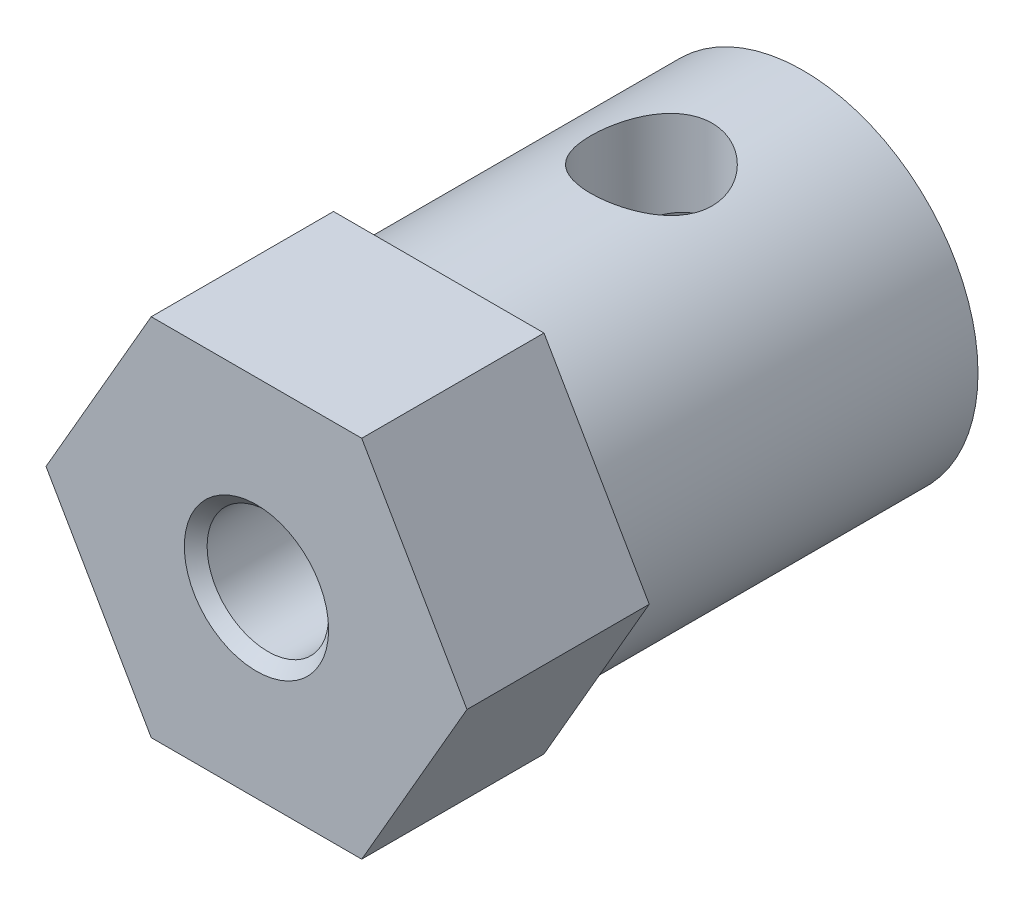
ISO-10303-21;
HEADER;
FILE_DESCRIPTION(('STEP AP214'),'2;1');
FILE_NAME('part.step','',(''),(''),'','','');
FILE_SCHEMA(('AUTOMOTIVE_DESIGN { 1 0 10303 214 1 1 1 1 }'));
ENDSEC;
DATA;
#1=APPLICATION_CONTEXT('core data for automotive mechanical design processes');
#2=APPLICATION_PROTOCOL_DEFINITION('international standard','automotive_design',2000,#1);
#3=PRODUCT_CONTEXT('',#1,'mechanical');
#4=PRODUCT('Part','Part','',(#3));
#5=PRODUCT_RELATED_PRODUCT_CATEGORY('part','',(#4));
#6=PRODUCT_DEFINITION_FORMATION('','',#4);
#7=PRODUCT_DEFINITION_CONTEXT('part definition',#1,'design');
#8=PRODUCT_DEFINITION('design','',#6,#7);
#9=PRODUCT_DEFINITION_SHAPE('','',#8);
#10=(LENGTH_UNIT() NAMED_UNIT(*) SI_UNIT(.MILLI.,.METRE.));
#11=(NAMED_UNIT(*) PLANE_ANGLE_UNIT() SI_UNIT($,.RADIAN.));
#12=(NAMED_UNIT(*) SI_UNIT($,.STERADIAN.) SOLID_ANGLE_UNIT());
#13=UNCERTAINTY_MEASURE_WITH_UNIT(LENGTH_MEASURE(1.E-05),#10,'distance_accuracy_value','');
#14=(GEOMETRIC_REPRESENTATION_CONTEXT(3) GLOBAL_UNCERTAINTY_ASSIGNED_CONTEXT((#13)) GLOBAL_UNIT_ASSIGNED_CONTEXT((#10,
#11,#12)) REPRESENTATION_CONTEXT('',''));
#15=CARTESIAN_POINT('',(0.,0.,0.));
#16=DIRECTION('',(0.,0.,1.));
#17=DIRECTION('',(1.,0.,0.));
#18=AXIS2_PLACEMENT_3D('',#15,#16,#17);
#19=CARTESIAN_POINT('',(-6.92820323027551,0.,0.));
#20=DIRECTION('',(-0.866025403784439,-0.499999999999999,0.));
#21=DIRECTION('',(0.499999999999999,-0.866025403784439,0.));
#22=AXIS2_PLACEMENT_3D('',#19,#20,#21);
#23=PLANE('',#22);
#24=DIRECTION('',(0.499999999999999,-0.866025403784439,0.));
#25=VECTOR('',#24,1.);
#26=CARTESIAN_POINT('',(-6.92820323027551,0.,6.));
#27=LINE('',#26,#25);
#28=CARTESIAN_POINT('',(-6.92820323027551,0.,6.));
#29=VERTEX_POINT('',#28);
#30=CARTESIAN_POINT('',(-3.46410161513776,-6.,6.));
#31=VERTEX_POINT('',#30);
#32=EDGE_CURVE('E125',#29,#31,#27,.T.);
#33=ORIENTED_EDGE('',*,*,#32,.F.);
#34=DIRECTION('',(0.,0.,1.));
#35=VECTOR('',#34,1.);
#36=CARTESIAN_POINT('',(-6.92820323027551,0.,0.));
#37=LINE('',#36,#35);
#38=CARTESIAN_POINT('',(-6.92820323027551,0.,0.));
#39=VERTEX_POINT('',#38);
#40=EDGE_CURVE('E54',#39,#29,#37,.T.);
#41=ORIENTED_EDGE('',*,*,#40,.F.);
#42=DIRECTION('',(0.499999999999999,-0.866025403784439,0.));
#43=VECTOR('',#42,1.);
#44=CARTESIAN_POINT('',(-6.92820323027551,0.,0.));
#45=LINE('',#44,#43);
#46=CARTESIAN_POINT('',(-3.46410161513776,-6.,0.));
#47=VERTEX_POINT('',#46);
#48=EDGE_CURVE('E141',#39,#47,#45,.T.);
#49=ORIENTED_EDGE('',*,*,#48,.T.);
#50=DIRECTION('',(0.,0.,1.));
#51=VECTOR('',#50,1.);
#52=CARTESIAN_POINT('',(-3.46410161513776,-6.,0.));
#53=LINE('',#52,#51);
#54=EDGE_CURVE('E89',#47,#31,#53,.T.);
#55=ORIENTED_EDGE('',*,*,#54,.T.);
#56=EDGE_LOOP('',(#33,#41,#49,#55));
#57=FACE_BOUND('',#56,.T.);
#58=ADVANCED_FACE('F36',(#57),#23,.T.);
#59=CARTESIAN_POINT('',(-3.46410161513775,6.,0.));
#60=DIRECTION('',(-0.866025403784438,0.5,0.));
#61=DIRECTION('',(-0.5,-0.866025403784439,0.));
#62=AXIS2_PLACEMENT_3D('',#59,#60,#61);
#63=PLANE('',#62);
#64=DIRECTION('',(-0.5,-0.866025403784439,0.));
#65=VECTOR('',#64,1.);
#66=CARTESIAN_POINT('',(-3.46410161513775,6.,6.));
#67=LINE('',#66,#65);
#68=CARTESIAN_POINT('',(-3.46410161513775,6.,6.));
#69=VERTEX_POINT('',#68);
#70=EDGE_CURVE('E138',#69,#29,#67,.T.);
#71=ORIENTED_EDGE('',*,*,#70,.F.);
#72=DIRECTION('',(0.,0.,1.));
#73=VECTOR('',#72,1.);
#74=CARTESIAN_POINT('',(-3.46410161513775,6.,0.));
#75=LINE('',#74,#73);
#76=CARTESIAN_POINT('',(-3.46410161513775,6.,0.));
#77=VERTEX_POINT('',#76);
#78=EDGE_CURVE('E77',#77,#69,#75,.T.);
#79=ORIENTED_EDGE('',*,*,#78,.F.);
#80=DIRECTION('',(-0.5,-0.866025403784439,0.));
#81=VECTOR('',#80,1.);
#82=CARTESIAN_POINT('',(-3.46410161513775,6.,0.));
#83=LINE('',#82,#81);
#84=EDGE_CURVE('E115',#77,#39,#83,.T.);
#85=ORIENTED_EDGE('',*,*,#84,.T.);
#86=ORIENTED_EDGE('',*,*,#40,.T.);
#87=EDGE_LOOP('',(#71,#79,#85,#86));
#88=FACE_BOUND('',#87,.T.);
#89=ADVANCED_FACE('F201',(#88),#63,.T.);
#90=CARTESIAN_POINT('',(3.46410161513776,6.,0.));
#91=DIRECTION('',(0.,1.,0.));
#92=DIRECTION('',(0.,0.,1.));
#93=AXIS2_PLACEMENT_3D('',#90,#91,#92);
#94=PLANE('',#93);
#95=DIRECTION('',(-1.,0.,0.));
#96=VECTOR('',#95,1.);
#97=CARTESIAN_POINT('',(3.46410161513776,6.,6.));
#98=LINE('',#97,#96);
#99=CARTESIAN_POINT('',(3.46410161513776,6.,6.));
#100=VERTEX_POINT('',#99);
#101=EDGE_CURVE('E102',#100,#69,#98,.T.);
#102=ORIENTED_EDGE('',*,*,#101,.F.);
#103=DIRECTION('',(0.,0.,1.));
#104=VECTOR('',#103,1.);
#105=CARTESIAN_POINT('',(3.46410161513776,6.,0.));
#106=LINE('',#105,#104);
#107=CARTESIAN_POINT('',(3.46410161513776,6.,0.));
#108=VERTEX_POINT('',#107);
#109=EDGE_CURVE('E97',#108,#100,#106,.T.);
#110=ORIENTED_EDGE('',*,*,#109,.F.);
#111=DIRECTION('',(-1.,0.,0.));
#112=VECTOR('',#111,1.);
#113=CARTESIAN_POINT('',(3.46410161513776,6.,0.));
#114=LINE('',#113,#112);
#115=EDGE_CURVE('E100',#108,#77,#114,.T.);
#116=ORIENTED_EDGE('',*,*,#115,.T.);
#117=ORIENTED_EDGE('',*,*,#78,.T.);
#118=EDGE_LOOP('',(#102,#110,#116,#117));
#119=FACE_BOUND('',#118,.T.);
#120=ADVANCED_FACE('F99',(#119),#94,.T.);
#121=CARTESIAN_POINT('',(6.92820323027551,0.,0.));
#122=DIRECTION('',(0.866025403784439,0.5,0.));
#123=DIRECTION('',(-0.5,0.866025403784439,0.));
#124=AXIS2_PLACEMENT_3D('',#121,#122,#123);
#125=PLANE('',#124);
#126=DIRECTION('',(-0.5,0.866025403784439,0.));
#127=VECTOR('',#126,1.);
#128=CARTESIAN_POINT('',(6.92820323027551,0.,6.));
#129=LINE('',#128,#127);
#130=CARTESIAN_POINT('',(6.92820323027551,0.,6.));
#131=VERTEX_POINT('',#130);
#132=EDGE_CURVE('E135',#131,#100,#129,.T.);
#133=ORIENTED_EDGE('',*,*,#132,.F.);
#134=DIRECTION('',(0.,0.,1.));
#135=VECTOR('',#134,1.);
#136=CARTESIAN_POINT('',(6.92820323027551,0.,0.));
#137=LINE('',#136,#135);
#138=CARTESIAN_POINT('',(6.92820323027551,0.,0.));
#139=VERTEX_POINT('',#138);
#140=EDGE_CURVE('E107',#139,#131,#137,.T.);
#141=ORIENTED_EDGE('',*,*,#140,.F.);
#142=DIRECTION('',(-0.5,0.866025403784439,0.));
#143=VECTOR('',#142,1.);
#144=CARTESIAN_POINT('',(6.92820323027551,0.,0.));
#145=LINE('',#144,#143);
#146=EDGE_CURVE('E113',#139,#108,#145,.T.);
#147=ORIENTED_EDGE('',*,*,#146,.T.);
#148=ORIENTED_EDGE('',*,*,#109,.T.);
#149=EDGE_LOOP('',(#133,#141,#147,#148));
#150=FACE_BOUND('',#149,.T.);
#151=ADVANCED_FACE('F117',(#150),#125,.T.);
#152=CARTESIAN_POINT('',(3.46410161513775,-6.,0.));
#153=DIRECTION('',(0.866025403784439,-0.5,0.));
#154=DIRECTION('',(0.5,0.866025403784439,0.));
#155=AXIS2_PLACEMENT_3D('',#152,#153,#154);
#156=PLANE('',#155);
#157=DIRECTION('',(0.5,0.866025403784439,0.));
#158=VECTOR('',#157,1.);
#159=CARTESIAN_POINT('',(3.46410161513775,-6.,6.));
#160=LINE('',#159,#158);
#161=CARTESIAN_POINT('',(3.46410161513775,-6.,6.));
#162=VERTEX_POINT('',#161);
#163=EDGE_CURVE('E132',#162,#131,#160,.T.);
#164=ORIENTED_EDGE('',*,*,#163,.F.);
#165=DIRECTION('',(0.,0.,1.));
#166=VECTOR('',#165,1.);
#167=CARTESIAN_POINT('',(3.46410161513775,-6.,0.));
#168=LINE('',#167,#166);
#169=CARTESIAN_POINT('',(3.46410161513775,-6.,0.));
#170=VERTEX_POINT('',#169);
#171=EDGE_CURVE('E145',#170,#162,#168,.T.);
#172=ORIENTED_EDGE('',*,*,#171,.F.);
#173=DIRECTION('',(0.5,0.866025403784439,0.));
#174=VECTOR('',#173,1.);
#175=CARTESIAN_POINT('',(3.46410161513775,-6.,0.));
#176=LINE('',#175,#174);
#177=EDGE_CURVE('E118',#170,#139,#176,.T.);
#178=ORIENTED_EDGE('',*,*,#177,.T.);
#179=ORIENTED_EDGE('',*,*,#140,.T.);
#180=EDGE_LOOP('',(#164,#172,#178,#179));
#181=FACE_BOUND('',#180,.T.);
#182=ADVANCED_FACE('F208',(#181),#156,.T.);
#183=CARTESIAN_POINT('',(-3.46410161513776,-6.,0.));
#184=DIRECTION('',(0.,-1.,0.));
#185=DIRECTION('',(0.,0.,-1.));
#186=AXIS2_PLACEMENT_3D('',#183,#184,#185);
#187=PLANE('',#186);
#188=DIRECTION('',(1.,0.,0.));
#189=VECTOR('',#188,1.);
#190=CARTESIAN_POINT('',(-3.46410161513776,-6.,6.));
#191=LINE('',#190,#189);
#192=EDGE_CURVE('E128',#31,#162,#191,.T.);
#193=ORIENTED_EDGE('',*,*,#192,.F.);
#194=ORIENTED_EDGE('',*,*,#54,.F.);
#195=DIRECTION('',(1.,0.,0.));
#196=VECTOR('',#195,1.);
#197=CARTESIAN_POINT('',(-3.46410161513776,-6.,0.));
#198=LINE('',#197,#196);
#199=EDGE_CURVE('E120',#47,#170,#198,.T.);
#200=ORIENTED_EDGE('',*,*,#199,.T.);
#201=ORIENTED_EDGE('',*,*,#171,.T.);
#202=EDGE_LOOP('',(#193,#194,#200,#201));
#203=FACE_BOUND('',#202,.T.);
#204=ADVANCED_FACE('F196',(#203),#187,.T.);
#205=CARTESIAN_POINT('',(0.,0.,0.));
#206=DIRECTION('',(0.,0.,1.));
#207=DIRECTION('',(1.,0.,0.));
#208=AXIS2_PLACEMENT_3D('',#205,#206,#207);
#209=PLANE('',#208);
#210=CARTESIAN_POINT('',(0.,0.,0.));
#211=DIRECTION('',(0.,0.,1.));
#212=DIRECTION('',(1.,0.,0.));
#213=AXIS2_PLACEMENT_3D('',#210,#211,#212);
#214=CIRCLE('',#213,5.75);
#215=CARTESIAN_POINT('',(5.75,0.,0.));
#216=VERTEX_POINT('',#215);
#217=EDGE_CURVE('E222',#216,#216,#214,.T.);
#218=ORIENTED_EDGE('',*,*,#217,.T.);
#219=EDGE_LOOP('',(#218));
#220=FACE_BOUND('',#219,.T.);
#221=ORIENTED_EDGE('',*,*,#48,.F.);
#222=ORIENTED_EDGE('',*,*,#84,.F.);
#223=ORIENTED_EDGE('',*,*,#115,.F.);
#224=ORIENTED_EDGE('',*,*,#146,.F.);
#225=ORIENTED_EDGE('',*,*,#177,.F.);
#226=ORIENTED_EDGE('',*,*,#199,.F.);
#227=EDGE_LOOP('',(#221,#222,#223,#224,#225,#226));
#228=FACE_BOUND('',#227,.T.);
#229=ADVANCED_FACE('F111',(#220,#228),#209,.F.);
#230=CARTESIAN_POINT('',(0.,0.,6.));
#231=DIRECTION('',(0.,0.,1.));
#232=DIRECTION('',(1.,0.,0.));
#233=AXIS2_PLACEMENT_3D('',#230,#231,#232);
#234=PLANE('',#233);
#235=CARTESIAN_POINT('',(0.,0.,6.));
#236=DIRECTION('',(0.,0.,1.));
#237=DIRECTION('',(1.,0.,0.));
#238=AXIS2_PLACEMENT_3D('',#235,#236,#237);
#239=CIRCLE('',#238,2.375);
#240=CARTESIAN_POINT('',(2.375,0.,6.));
#241=VERTEX_POINT('',#240);
#242=EDGE_CURVE('E46',#241,#241,#239,.F.);
#243=ORIENTED_EDGE('',*,*,#242,.T.);
#244=EDGE_LOOP('',(#243));
#245=FACE_BOUND('',#244,.T.);
#246=ORIENTED_EDGE('',*,*,#32,.T.);
#247=ORIENTED_EDGE('',*,*,#192,.T.);
#248=ORIENTED_EDGE('',*,*,#163,.T.);
#249=ORIENTED_EDGE('',*,*,#132,.T.);
#250=ORIENTED_EDGE('',*,*,#101,.T.);
#251=ORIENTED_EDGE('',*,*,#70,.T.);
#252=EDGE_LOOP('',(#246,#247,#248,#249,#250,#251));
#253=FACE_BOUND('',#252,.T.);
#254=ADVANCED_FACE('F190',(#245,#253),#234,.T.);
#255=CARTESIAN_POINT('',(0.,0.,-12.));
#256=DIRECTION('',(0.,0.,1.));
#257=DIRECTION('',(1.,0.,0.));
#258=AXIS2_PLACEMENT_3D('',#255,#256,#257);
#259=CYLINDRICAL_SURFACE('',#258,5.75);
#260=CARTESIAN_POINT('',(0.,-5.75,-5.));
#261=CARTESIAN_POINT('',(-0.108852978365249,-5.75000105977138,-4.99999847605276));
#262=CARTESIAN_POINT('',(-0.217695096262046,-5.7468809830917,-5.00891530264599));
#263=CARTESIAN_POINT('',(-0.432157202530257,-5.73474311765259,-5.04422620104696));
#264=CARTESIAN_POINT('',(-0.537777134658955,-5.72572522600935,-5.07062057774006));
#265=CARTESIAN_POINT('',(-0.742672134315643,-5.70276766059395,-5.13986102453221));
#266=CARTESIAN_POINT('',(-0.84195801047287,-5.6888366512501,-5.18267814420332));
#267=CARTESIAN_POINT('',(-1.03193713439356,-5.6574630536252,-5.28341226596707));
#268=CARTESIAN_POINT('',(-1.12262845549451,-5.64001968069461,-5.3413326429281));
#269=CARTESIAN_POINT('',(-1.29622800224639,-5.60271764264612,-5.47289485603425));
#270=CARTESIAN_POINT('',(-1.37877181526939,-5.58279747059658,-5.54699998115126));
#271=CARTESIAN_POINT('',(-1.53054382641711,-5.54311294173497,-5.7078438303783));
#272=CARTESIAN_POINT('',(-1.59976873225049,-5.52334862460348,-5.79458566886148));
#273=CARTESIAN_POINT('',(-1.72509619684457,-5.48552407526656,-5.98161459511855));
#274=CARTESIAN_POINT('',(-1.78071137601298,-5.46753803395443,-6.08224474438048));
#275=CARTESIAN_POINT('',(-1.87407012610003,-5.43624902273522,-6.29215623393371));
#276=CARTESIAN_POINT('',(-1.91181970820632,-5.42294447804504,-6.40143464990117));
#277=CARTESIAN_POINT('',(-1.96698431950335,-5.40317577936257,-6.62137705882684));
#278=CARTESIAN_POINT('',(-1.98508676076966,-5.3964811809919,-6.73184728421305));
#279=CARTESIAN_POINT('',(-2.00259265649612,-5.39001096702764,-6.95444445734178));
#280=CARTESIAN_POINT('',(-2.00200251085504,-5.39023298334866,-7.06657082491874));
#281=CARTESIAN_POINT('',(-1.98267094037132,-5.39737004860089,-7.28329786208771));
#282=CARTESIAN_POINT('',(-1.96484468215553,-5.40394763135404,-7.38799324741789));
#283=CARTESIAN_POINT('',(-1.91304654963828,-5.42249959851242,-7.5928021417439));
#284=CARTESIAN_POINT('',(-1.87907257989678,-5.43447468332486,-7.69291505423702));
#285=CARTESIAN_POINT('',(-1.79537763727284,-5.46269998592354,-7.88772373137553));
#286=CARTESIAN_POINT('',(-1.74539706558117,-5.47901987559443,-7.98229743150764));
#287=CARTESIAN_POINT('',(-1.63128802471841,-5.51406876213116,-8.16199681263434));
#288=CARTESIAN_POINT('',(-1.56715518557209,-5.53279850237071,-8.24711956310907));
#289=CARTESIAN_POINT('',(-1.42223676822475,-5.57186501514894,-8.41061861686602));
#290=CARTESIAN_POINT('',(-1.34070873037362,-5.59223244327248,-8.48833094809252));
#291=CARTESIAN_POINT('',(-1.16553110913772,-5.63134817365665,-8.62916193353523));
#292=CARTESIAN_POINT('',(-1.07188014909169,-5.65009629162705,-8.69227892805479));
#293=CARTESIAN_POINT('',(-0.873611804787463,-5.68414660658285,-8.80272645587849));
#294=CARTESIAN_POINT('',(-0.76887945860933,-5.699406152222,-8.84986468018437));
#295=CARTESIAN_POINT('',(-0.552311768940697,-5.72444844073633,-8.92564240487892));
#296=CARTESIAN_POINT('',(-0.440479139770791,-5.73423326263741,-8.95428892812568));
#297=CARTESIAN_POINT('',(-0.21849545926509,-5.74687209990773,-8.99106038151012));
#298=CARTESIAN_POINT('',(-0.108509883546711,-5.75002852027091,-9.00008142039351));
#299=CARTESIAN_POINT('',(0.111434426219061,-5.74997110798103,-8.99991751072368));
#300=CARTESIAN_POINT('',(0.221393161453882,-5.74675846011365,-8.99073594825153));
#301=CARTESIAN_POINT('',(0.434480397636876,-5.7345237410022,-8.95512793639705));
#302=CARTESIAN_POINT('',(0.537714854552466,-5.72569124816727,-8.92926387296158));
#303=CARTESIAN_POINT('',(0.738327773381861,-5.70329449927519,-8.8617406394204));
#304=CARTESIAN_POINT('',(0.835705476721866,-5.68972963181587,-8.8200794283316));
#305=CARTESIAN_POINT('',(1.02483137768094,-5.65876849709659,-8.72088246415644));
#306=CARTESIAN_POINT('',(1.11635106072609,-5.64127710756371,-8.66294159169097));
#307=CARTESIAN_POINT('',(1.28865281845096,-5.60443124496091,-8.53329937952551));
#308=CARTESIAN_POINT('',(1.36943134970039,-5.58507616068386,-8.46159351782194));
#309=CARTESIAN_POINT('',(1.52214180412769,-5.5454593147938,-8.30225036027706));
#310=CARTESIAN_POINT('',(1.59343483693754,-5.52520028105738,-8.21399855713608));
#311=CARTESIAN_POINT('',(1.72029440578916,-5.48702921650036,-8.02635822377912));
#312=CARTESIAN_POINT('',(1.77586045138567,-5.46911725888256,-7.92696934638895));
#313=CARTESIAN_POINT('',(1.86951792756813,-5.43781707054005,-7.71960785457887));
#314=CARTESIAN_POINT('',(1.90761420567768,-5.42442758518847,-7.61163763108563));
#315=CARTESIAN_POINT('',(1.96488570955564,-5.40394922705042,-7.39023283004293));
#316=CARTESIAN_POINT('',(1.98407048282081,-5.39685717517642,-7.27680104014157));
#317=CARTESIAN_POINT('',(2.00219056030477,-5.39015926521285,-7.05450432211135));
#318=CARTESIAN_POINT('',(2.00219579967984,-5.39015785230511,-6.94573763682946));
#319=CARTESIAN_POINT('',(1.98462636890616,-5.39665117522238,-6.72984134603797));
#320=CARTESIAN_POINT('',(1.96705293147735,-5.40314545553126,-6.62271162626959));
#321=CARTESIAN_POINT('',(1.91560968443532,-5.42159158710503,-6.41555214132175));
#322=CARTESIAN_POINT('',(1.88211624119565,-5.43341708560692,-6.31541675492714));
#323=CARTESIAN_POINT('',(1.80009668185863,-5.46113696636217,-6.12211468786719));
#324=CARTESIAN_POINT('',(1.75156705321561,-5.47703229920316,-6.0289496418363));
#325=CARTESIAN_POINT('',(1.63820986264075,-5.51202675271731,-5.84750701006089));
#326=CARTESIAN_POINT('',(1.57272640439311,-5.53124091497049,-5.75966156866263));
#327=CARTESIAN_POINT('',(1.42839709339464,-5.57025708065954,-5.59586159187356));
#328=CARTESIAN_POINT('',(1.34954730547059,-5.59005925579168,-5.51991057101754));
#329=CARTESIAN_POINT('',(1.17657783293987,-5.62906303688251,-5.37868422926783));
#330=CARTESIAN_POINT('',(1.08194016541955,-5.6482002284327,-5.31402310323816));
#331=CARTESIAN_POINT('',(0.882491703832236,-5.68277534462883,-5.2015820521677));
#332=CARTESIAN_POINT('',(0.777682430932428,-5.69821382122474,-5.15379960785804));
#333=CARTESIAN_POINT('',(0.562471003980704,-5.72343194027046,-5.07738200592012));
#334=CARTESIAN_POINT('',(0.452179507396609,-5.7332948736695,-5.04846397271358));
#335=CARTESIAN_POINT('',(0.227920527633803,-5.74657724914793,-5.00977703551417));
#336=CARTESIAN_POINT('',(0.113954312686564,-5.74999889056302,-5.00000159536618));
#337=CARTESIAN_POINT('',(0.,-5.75,-5.));
#338=B_SPLINE_CURVE_WITH_KNOTS('',3,(#260,#261,#262,#263,#264,#265,#266,#267,#268,#269,#270,
#271,#272,#273,#274,#275,#276,#277,#278,#279,#280,#281,#282,#283,#284,#285,#286,#287,#288,#289,
#290,#291,#292,#293,#294,#295,#296,#297,#298,#299,#300,#301,#302,#303,#304,#305,#306,#307,#308,
#309,#310,#311,#312,#313,#314,#315,#316,#317,#318,#319,#320,#321,#322,#323,#324,#325,#326,#327,
#328,#329,#330,#331,#332,#333,#334,#335,#336,#337),.UNSPECIFIED.,.T.,.F.,(4,2,2,2,2,2,2,2,2,2,2,
2,2,2,2,2,2,2,2,2,2,2,2,2,2,2,2,2,2,2,2,2,2,2,2,2,2,2,4),(0.,0.32613924766348,0.652284184780103,
0.977856808289853,1.30350224441925,1.64010141968048,1.97678369205918,2.32417411211769,
2.67144756344385,3.00613452597769,3.34070690086606,3.65843808310683,3.97621050763108,
4.29942249217286,4.62273441898187,4.96453129941075,5.3063670278975,5.65218178158108,
5.99786512285308,6.32740068856532,6.65687495922301,6.9757848499627,7.29473595773798,
7.62246000007288,7.95029188944544,8.29441087883626,8.63854059837753,8.9825747706908,
9.32643516783486,9.65111291601981,9.97576789749261,10.2931029151941,10.6105121202775,
10.9427610820904,11.2751080315514,11.6220288757028,11.9688979174354,12.3104381374149,
12.6518617196241),.UNSPECIFIED.);
#339=CARTESIAN_POINT('',(0.,-5.75,-5.));
#340=VERTEX_POINT('',#339);
#341=EDGE_CURVE('E173',#340,#340,#338,.T.);
#342=ORIENTED_EDGE('',*,*,#341,.F.);
#343=EDGE_LOOP('',(#342));
#344=FACE_BOUND('',#343,.T.);
#345=CARTESIAN_POINT('',(0.,5.75,-5.));
#346=CARTESIAN_POINT('',(0.108852978365252,5.75000105977138,-4.99999847605276));
#347=CARTESIAN_POINT('',(0.217695096262048,5.7468809830917,-5.00891530264599));
#348=CARTESIAN_POINT('',(0.43215720253026,5.73474311765259,-5.04422620104696));
#349=CARTESIAN_POINT('',(0.537777134658958,5.72572522600935,-5.07062057774006));
#350=CARTESIAN_POINT('',(0.742672134315646,5.70276766059395,-5.13986102453221));
#351=CARTESIAN_POINT('',(0.841958010472873,5.6888366512501,-5.18267814420332));
#352=CARTESIAN_POINT('',(1.03193713439357,5.6574630536252,-5.28341226596707));
#353=CARTESIAN_POINT('',(1.12262845549452,5.64001968069461,-5.3413326429281));
#354=CARTESIAN_POINT('',(1.29622800224639,5.60271764264612,-5.47289485603425));
#355=CARTESIAN_POINT('',(1.37877181526939,5.58279747059658,-5.54699998115126));
#356=CARTESIAN_POINT('',(1.53054382641712,5.54311294173497,-5.7078438303783));
#357=CARTESIAN_POINT('',(1.59976873225049,5.52334862460348,-5.79458566886148));
#358=CARTESIAN_POINT('',(1.72509619684457,5.48552407526656,-5.98161459511855));
#359=CARTESIAN_POINT('',(1.78071137601298,5.46753803395443,-6.08224474438048));
#360=CARTESIAN_POINT('',(1.87407012610003,5.43624902273521,-6.2921562339337));
#361=CARTESIAN_POINT('',(1.91181970820632,5.42294447804504,-6.40143464990117));
#362=CARTESIAN_POINT('',(1.96698431950335,5.40317577936257,-6.62137705882684));
#363=CARTESIAN_POINT('',(1.98508676076967,5.3964811809919,-6.73184728421305));
#364=CARTESIAN_POINT('',(2.00259265649612,5.39001096702764,-6.95444445734177));
#365=CARTESIAN_POINT('',(2.00200251085504,5.39023298334866,-7.06657082491874));
#366=CARTESIAN_POINT('',(1.98267094037133,5.39737004860089,-7.28329786208771));
#367=CARTESIAN_POINT('',(1.96484468215553,5.40394763135404,-7.38799324741788));
#368=CARTESIAN_POINT('',(1.91304654963829,5.42249959851242,-7.5928021417439));
#369=CARTESIAN_POINT('',(1.87907257989678,5.43447468332486,-7.69291505423702));
#370=CARTESIAN_POINT('',(1.79537763727285,5.46269998592354,-7.88772373137553));
#371=CARTESIAN_POINT('',(1.74539706558118,5.47901987559443,-7.98229743150764));
#372=CARTESIAN_POINT('',(1.63128802471842,5.51406876213116,-8.16199681263434));
#373=CARTESIAN_POINT('',(1.5671551855721,5.53279850237071,-8.24711956310906));
#374=CARTESIAN_POINT('',(1.42223676822475,5.57186501514894,-8.41061861686602));
#375=CARTESIAN_POINT('',(1.34070873037362,5.59223244327248,-8.48833094809252));
#376=CARTESIAN_POINT('',(1.16553110913772,5.63134817365665,-8.62916193353523));
#377=CARTESIAN_POINT('',(1.07188014909169,5.65009629162705,-8.69227892805479));
#378=CARTESIAN_POINT('',(0.873611804787469,5.68414660658285,-8.80272645587849));
#379=CARTESIAN_POINT('',(0.768879458609336,5.69940615222199,-8.84986468018437));
#380=CARTESIAN_POINT('',(0.552311768940703,5.72444844073632,-8.92564240487892));
#381=CARTESIAN_POINT('',(0.440479139770796,5.73423326263741,-8.95428892812568));
#382=CARTESIAN_POINT('',(0.218495459265095,5.74687209990773,-8.99106038151012));
#383=CARTESIAN_POINT('',(0.108509883546716,5.75002852027091,-9.00008142039351));
#384=CARTESIAN_POINT('',(-0.111434426219056,5.74997110798103,-8.99991751072368));
#385=CARTESIAN_POINT('',(-0.221393161453876,5.74675846011365,-8.99073594825153));
#386=CARTESIAN_POINT('',(-0.43448039763687,5.7345237410022,-8.95512793639705));
#387=CARTESIAN_POINT('',(-0.53771485455246,5.72569124816727,-8.92926387296158));
#388=CARTESIAN_POINT('',(-0.738327773381856,5.70329449927519,-8.8617406394204));
#389=CARTESIAN_POINT('',(-0.835705476721861,5.68972963181587,-8.8200794283316));
#390=CARTESIAN_POINT('',(-1.02483137768094,5.65876849709659,-8.72088246415644));
#391=CARTESIAN_POINT('',(-1.11635106072608,5.64127710756372,-8.66294159169097));
#392=CARTESIAN_POINT('',(-1.28865281845096,5.60443124496091,-8.53329937952552));
#393=CARTESIAN_POINT('',(-1.36943134970039,5.58507616068386,-8.46159351782194));
#394=CARTESIAN_POINT('',(-1.52214180412769,5.5454593147938,-8.30225036027707));
#395=CARTESIAN_POINT('',(-1.59343483693754,5.52520028105738,-8.21399855713608));
#396=CARTESIAN_POINT('',(-1.72029440578916,5.48702921650036,-8.02635822377912));
#397=CARTESIAN_POINT('',(-1.77586045138566,5.46911725888256,-7.92696934638895));
#398=CARTESIAN_POINT('',(-1.86951792756812,5.43781707054005,-7.71960785457887));
#399=CARTESIAN_POINT('',(-1.90761420567768,5.42442758518847,-7.61163763108562));
#400=CARTESIAN_POINT('',(-1.96488570955564,5.40394922705042,-7.39023283004293));
#401=CARTESIAN_POINT('',(-1.98407048282081,5.39685717517642,-7.27680104014157));
#402=CARTESIAN_POINT('',(-2.00219056030476,5.39015926521285,-7.05450432211135));
#403=CARTESIAN_POINT('',(-2.00219579967983,5.39015785230511,-6.94573763682946));
#404=CARTESIAN_POINT('',(-1.98462636890616,5.39665117522238,-6.72984134603797));
#405=CARTESIAN_POINT('',(-1.96705293147734,5.40314545553127,-6.62271162626959));
#406=CARTESIAN_POINT('',(-1.91560968443531,5.42159158710504,-6.41555214132175));
#407=CARTESIAN_POINT('',(-1.88211624119565,5.43341708560692,-6.31541675492714));
#408=CARTESIAN_POINT('',(-1.80009668185863,5.46113696636217,-6.12211468786719));
#409=CARTESIAN_POINT('',(-1.7515670532156,5.47703229920316,-6.0289496418363));
#410=CARTESIAN_POINT('',(-1.63820986264075,5.51202675271731,-5.8475070100609));
#411=CARTESIAN_POINT('',(-1.5727264043931,5.5312409149705,-5.75966156866264));
#412=CARTESIAN_POINT('',(-1.42839709339464,5.57025708065954,-5.59586159187356));
#413=CARTESIAN_POINT('',(-1.34954730547059,5.59005925579168,-5.51991057101754));
#414=CARTESIAN_POINT('',(-1.17657783293987,5.62906303688251,-5.37868422926783));
#415=CARTESIAN_POINT('',(-1.08194016541954,5.6482002284327,-5.31402310323816));
#416=CARTESIAN_POINT('',(-0.882491703832234,5.68277534462883,-5.2015820521677));
#417=CARTESIAN_POINT('',(-0.777682430932426,5.69821382122474,-5.15379960785804));
#418=CARTESIAN_POINT('',(-0.562471003980701,5.72343194027046,-5.07738200592012));
#419=CARTESIAN_POINT('',(-0.452179507396606,5.7332948736695,-5.04846397271358));
#420=CARTESIAN_POINT('',(-0.2279205276338,5.74657724914793,-5.00977703551417));
#421=CARTESIAN_POINT('',(-0.113954312686561,5.74999889056302,-5.00000159536618));
#422=CARTESIAN_POINT('',(0.,5.75,-5.));
#423=B_SPLINE_CURVE_WITH_KNOTS('',3,(#345,#346,#347,#348,#349,#350,#351,#352,#353,#354,#355,
#356,#357,#358,#359,#360,#361,#362,#363,#364,#365,#366,#367,#368,#369,#370,#371,#372,#373,#374,
#375,#376,#377,#378,#379,#380,#381,#382,#383,#384,#385,#386,#387,#388,#389,#390,#391,#392,#393,
#394,#395,#396,#397,#398,#399,#400,#401,#402,#403,#404,#405,#406,#407,#408,#409,#410,#411,#412,
#413,#414,#415,#416,#417,#418,#419,#420,#421,#422),.UNSPECIFIED.,.T.,.F.,(4,2,2,2,2,2,2,2,2,2,2,
2,2,2,2,2,2,2,2,2,2,2,2,2,2,2,2,2,2,2,2,2,2,2,2,2,2,2,4),(0.,0.326139247663481,
0.652284184780103,0.977856808289853,1.30350224441925,1.64010141968048,1.97678369205918,
2.32417411211769,2.67144756344385,3.00613452597769,3.34070690086606,3.65843808310683,
3.97621050763108,4.29942249217286,4.62273441898187,4.96453129941074,5.3063670278975,
5.65218178158108,5.99786512285308,6.32740068856532,6.65687495922301,6.9757848499627,
7.29473595773798,7.62246000007288,7.95029188944544,8.29441087883626,8.63854059837753,
8.9825747706908,9.32643516783486,9.65111291601981,9.97576789749261,10.2931029151941,
10.6105121202775,10.9427610820904,11.2751080315514,11.6220288757028,11.9688979174354,
12.3104381374149,12.6518617196241),.UNSPECIFIED.);
#424=CARTESIAN_POINT('',(0.,5.75,-5.));
#425=VERTEX_POINT('',#424);
#426=EDGE_CURVE('E179',#425,#425,#423,.T.);
#427=ORIENTED_EDGE('',*,*,#426,.F.);
#428=EDGE_LOOP('',(#427));
#429=FACE_BOUND('',#428,.T.);
#430=CARTESIAN_POINT('',(0.,0.,-12.));
#431=DIRECTION('',(0.,0.,1.));
#432=DIRECTION('',(1.,0.,0.));
#433=AXIS2_PLACEMENT_3D('',#430,#431,#432);
#434=CIRCLE('',#433,5.75);
#435=CARTESIAN_POINT('',(5.75,0.,-12.));
#436=VERTEX_POINT('',#435);
#437=EDGE_CURVE('E129',#436,#436,#434,.T.);
#438=ORIENTED_EDGE('',*,*,#437,.T.);
#439=EDGE_LOOP('',(#438));
#440=FACE_BOUND('',#439,.T.);
#441=ORIENTED_EDGE('',*,*,#217,.F.);
#442=EDGE_LOOP('',(#441));
#443=FACE_BOUND('',#442,.T.);
#444=ADVANCED_FACE('F184',(#344,#429,#440,#443),#259,.T.);
#445=CARTESIAN_POINT('',(5.75,0.,-12.));
#446=DIRECTION('',(0.,0.,-1.));
#447=DIRECTION('',(-1.,0.,0.));
#448=AXIS2_PLACEMENT_3D('',#445,#446,#447);
#449=PLANE('',#448);
#450=CARTESIAN_POINT('',(0.,0.,-12.));
#451=DIRECTION('',(0.,0.,-1.));
#452=DIRECTION('',(-1.,0.,0.));
#453=AXIS2_PLACEMENT_3D('',#450,#451,#452);
#454=CIRCLE('',#453,3.);
#455=CARTESIAN_POINT('',(-3.,0.,-12.));
#456=VERTEX_POINT('',#455);
#457=EDGE_CURVE('E230',#456,#456,#454,.T.);
#458=ORIENTED_EDGE('',*,*,#457,.F.);
#459=EDGE_LOOP('',(#458));
#460=FACE_BOUND('',#459,.T.);
#461=ORIENTED_EDGE('',*,*,#437,.F.);
#462=EDGE_LOOP('',(#461));
#463=FACE_BOUND('',#462,.T.);
#464=ADVANCED_FACE('F189',(#460,#463),#449,.T.);
#465=CARTESIAN_POINT('',(0.,0.,-12.));
#466=DIRECTION('',(0.,0.,-1.));
#467=DIRECTION('',(-1.,0.,0.));
#468=AXIS2_PLACEMENT_3D('',#465,#466,#467);
#469=CYLINDRICAL_SURFACE('',#468,2.);
#470=CARTESIAN_POINT('',(0.,0.,5.625));
#471=DIRECTION('',(0.,0.,1.));
#472=DIRECTION('',(1.,0.,0.));
#473=AXIS2_PLACEMENT_3D('',#470,#471,#472);
#474=CIRCLE('',#473,2.);
#475=CARTESIAN_POINT('',(2.,0.,5.625));
#476=VERTEX_POINT('',#475);
#477=EDGE_CURVE('E11',#476,#476,#474,.T.);
#478=ORIENTED_EDGE('',*,*,#477,.T.);
#479=EDGE_LOOP('',(#478));
#480=FACE_BOUND('',#479,.T.);
#481=CARTESIAN_POINT('',(0.,0.,0.));
#482=DIRECTION('',(0.,0.,-1.));
#483=DIRECTION('',(-1.,0.,0.));
#484=AXIS2_PLACEMENT_3D('',#481,#482,#483);
#485=CIRCLE('',#484,2.);
#486=CARTESIAN_POINT('',(-2.,0.,0.));
#487=VERTEX_POINT('',#486);
#488=EDGE_CURVE('E225',#487,#487,#485,.T.);
#489=ORIENTED_EDGE('',*,*,#488,.T.);
#490=EDGE_LOOP('',(#489));
#491=FACE_BOUND('',#490,.T.);
#492=ADVANCED_FACE('F245',(#480,#491),#469,.F.);
#493=CARTESIAN_POINT('',(2.,0.,0.));
#494=DIRECTION('',(0.,0.,1.));
#495=DIRECTION('',(1.,0.,0.));
#496=AXIS2_PLACEMENT_3D('',#493,#494,#495);
#497=PLANE('',#496);
#498=ORIENTED_EDGE('',*,*,#488,.F.);
#499=EDGE_LOOP('',(#498));
#500=FACE_BOUND('',#499,.T.);
#501=CARTESIAN_POINT('',(0.,0.,0.));
#502=DIRECTION('',(0.,0.,-1.));
#503=DIRECTION('',(-1.,0.,0.));
#504=AXIS2_PLACEMENT_3D('',#501,#502,#503);
#505=CIRCLE('',#504,3.);
#506=CARTESIAN_POINT('',(-3.,0.,0.));
#507=VERTEX_POINT('',#506);
#508=EDGE_CURVE('E228',#507,#507,#505,.T.);
#509=ORIENTED_EDGE('',*,*,#508,.T.);
#510=EDGE_LOOP('',(#509));
#511=FACE_BOUND('',#510,.T.);
#512=ADVANCED_FACE('F250',(#500,#511),#497,.F.);
#513=CARTESIAN_POINT('',(0.,0.,-12.));
#514=DIRECTION('',(0.,0.,-1.));
#515=DIRECTION('',(-1.,0.,0.));
#516=AXIS2_PLACEMENT_3D('',#513,#514,#515);
#517=CYLINDRICAL_SURFACE('',#516,3.);
#518=CARTESIAN_POINT('',(0.,-3.,-5.));
#519=CARTESIAN_POINT('',(-0.100484716668076,-3.00000041644839,-4.99999945036753));
#520=CARTESIAN_POINT('',(-0.200969087132899,-2.99490802753388,-5.0076139699555));
#521=CARTESIAN_POINT('',(-0.398733058031679,-2.97504652423808,-5.03759686410566));
#522=CARTESIAN_POINT('',(-0.496011113955004,-2.96027281581234,-5.05997224312329));
#523=CARTESIAN_POINT('',(-0.684212307854247,-2.92250482404708,-5.11810771732484));
#524=CARTESIAN_POINT('',(-0.775162872657552,-2.89954905493315,-5.15380514000794));
#525=CARTESIAN_POINT('',(-0.949415290997258,-2.8472613787744,-5.2370633632715));
#526=CARTESIAN_POINT('',(-1.03271603160967,-2.81792854605509,-5.28462588630056));
#527=CARTESIAN_POINT('',(-1.19728470077011,-2.75227329369838,-5.39465693736743));
#528=CARTESIAN_POINT('',(-1.27778030546067,-2.71556897579319,-5.45804786074289));
#529=CARTESIAN_POINT('',(-1.42772804469274,-2.63982313083466,-5.59573004865845));
#530=CARTESIAN_POINT('',(-1.49716405543888,-2.60077830356832,-5.67003692983773));
#531=CARTESIAN_POINT('',(-1.63422297745496,-2.51728264678793,-5.84105236761267));
#532=CARTESIAN_POINT('',(-1.6998318636275,-2.47295067937795,-5.93944565320345));
#533=CARTESIAN_POINT('',(-1.81350357014174,-2.3908414735282,-6.14836337764653));
#534=CARTESIAN_POINT('',(-1.86159673426502,-2.35305295954667,-6.25886640156274));
#535=CARTESIAN_POINT('',(-1.92674035011438,-2.2997626664146,-6.45671129342162));
#536=CARTESIAN_POINT('',(-1.94874447236008,-2.28097627892403,-6.54152845287391));
#537=CARTESIAN_POINT('',(-1.98150617785228,-2.25257969659604,-6.71474450474165));
#538=CARTESIAN_POINT('',(-1.99228314651963,-2.24295368744147,-6.80313694872606));
#539=CARTESIAN_POINT('',(-2.00191364141227,-2.23436605608045,-6.98147477885647));
#540=CARTESIAN_POINT('',(-2.00071842917524,-2.23544802558502,-7.0714250234524));
#541=CARTESIAN_POINT('',(-1.98637581333356,-2.24819775483425,-7.24963497349975));
#542=CARTESIAN_POINT('',(-1.97321828380393,-2.25987448286881,-7.33789318202813));
#543=CARTESIAN_POINT('',(-1.93664994217326,-2.29127185989959,-7.50646705124188));
#544=CARTESIAN_POINT('',(-1.91371711479477,-2.31061488324374,-7.58696133593877));
#545=CARTESIAN_POINT('',(-1.85870118583424,-2.35509622933623,-7.74302369097578));
#546=CARTESIAN_POINT('',(-1.8266150732855,-2.38023645854889,-7.81859013023865));
#547=CARTESIAN_POINT('',(-1.74673818732648,-2.43964196377947,-7.97902539535644));
#548=CARTESIAN_POINT('',(-1.69708052300445,-2.47472317740626,-8.06265990048309));
#549=CARTESIAN_POINT('',(-1.58668960438221,-2.54691537733438,-8.22138339528575));
#550=CARTESIAN_POINT('',(-1.52594268999614,-2.58402882709328,-8.29646165776207));
#551=CARTESIAN_POINT('',(-1.37981165322309,-2.66543343763724,-8.45254254560342));
#552=CARTESIAN_POINT('',(-1.29193938283656,-2.7095474472056,-8.53133404868276));
#553=CARTESIAN_POINT('',(-1.10200799908008,-2.79218100665211,-8.67319649453848));
#554=CARTESIAN_POINT('',(-0.999962299343698,-2.83070577648042,-8.73628214540898));
#555=CARTESIAN_POINT('',(-0.804857827096532,-2.89145404090364,-8.83347771862287));
#556=CARTESIAN_POINT('',(-0.713957643371912,-2.91539261165539,-8.87084336333893));
#557=CARTESIAN_POINT('',(-0.526036043935483,-2.95507719030498,-8.93210492562537));
#558=CARTESIAN_POINT('',(-0.429019879001653,-2.97083012127543,-8.95601222713221));
#559=CARTESIAN_POINT('',(-0.230985453172284,-2.99275882156808,-8.989161165238));
#560=CARTESIAN_POINT('',(-0.129951811934161,-2.99889322461186,-8.99833946093826));
#561=CARTESIAN_POINT('',(0.0724415193893439,-3.00083114965146,-9.0012470885622));
#562=CARTESIAN_POINT('',(0.173801186186622,-2.99663539385634,-8.99497750048877));
#563=CARTESIAN_POINT('',(0.366455717204236,-2.97899589424273,-8.96837594443805));
#564=CARTESIAN_POINT('',(0.45795744467919,-2.96622246390226,-8.94906270224478));
#565=CARTESIAN_POINT('',(0.636116392427398,-2.93318449284837,-8.89840431398714));
#566=CARTESIAN_POINT('',(0.722772837571131,-2.91291875746988,-8.86705724907179));
#567=CARTESIAN_POINT('',(0.894664750465994,-2.86496352529157,-8.79134770295508));
#568=CARTESIAN_POINT('',(0.979496184631417,-2.83689870135785,-8.74631184591815));
#569=CARTESIAN_POINT('',(1.14068302395729,-2.7760185561151,-8.64556671005373));
#570=CARTESIAN_POINT('',(1.2170331482009,-2.74320030403941,-8.58985083946783));
#571=CARTESIAN_POINT('',(1.37185445482324,-2.6695454665343,-8.45939213184249));
#572=CARTESIAN_POINT('',(1.44875187569565,-2.62826156800165,-8.38303373992492));
#573=CARTESIAN_POINT('',(1.58933968069449,-2.54571173085957,-8.21888857004289));
#574=CARTESIAN_POINT('',(1.6530209365723,-2.50444582417845,-8.1310939608925));
#575=CARTESIAN_POINT('',(1.76124776549313,-2.4293967897058,-7.95285758723188));
#576=CARTESIAN_POINT('',(1.80695636125283,-2.39527597025701,-7.86326796653779));
#577=CARTESIAN_POINT('',(1.88496213740264,-2.33438974266154,-7.67612734755637));
#578=CARTESIAN_POINT('',(1.91728345682189,-2.30761112529821,-7.57859106169538));
#579=CARTESIAN_POINT('',(1.9623584346534,-2.26933208182632,-7.39543551280459));
#580=CARTESIAN_POINT('',(1.97758597566225,-2.25594998021257,-7.31082819012399));
#581=CARTESIAN_POINT('',(1.99699205923373,-2.23879466438397,-7.13942671868162));
#582=CARTESIAN_POINT('',(2.00118260285317,-2.23501101347816,-7.05263504886051));
#583=CARTESIAN_POINT('',(1.99823921981266,-2.23764201149981,-6.87935694327631));
#584=CARTESIAN_POINT('',(1.99109858767784,-2.24406269907463,-6.79287071862625));
#585=CARTESIAN_POINT('',(1.96596997224746,-2.26610452403491,-6.62265647146789));
#586=CARTESIAN_POINT('',(1.94796751728258,-2.28173793527615,-6.53893228617568));
#587=CARTESIAN_POINT('',(1.89593035657494,-2.325268439048,-6.35428881351877));
#588=CARTESIAN_POINT('',(1.85890187130765,-2.35532333574982,-6.25473228705668));
#589=CARTESIAN_POINT('',(1.77084526236221,-2.42222161121308,-6.0645131656158));
#590=CARTESIAN_POINT('',(1.7197974834126,-2.45907449686699,-5.97386330200832));
#591=CARTESIAN_POINT('',(1.60398280555153,-2.53617186577118,-5.80071811286378));
#592=CARTESIAN_POINT('',(1.53898309894022,-2.57646587392279,-5.71840125457696));
#593=CARTESIAN_POINT('',(1.39671768031095,-2.65628301537843,-5.56467752174208));
#594=CARTESIAN_POINT('',(1.31944821025749,-2.69580590832395,-5.4932740029708));
#595=CARTESIAN_POINT('',(1.14145732976975,-2.77631551964082,-5.35328789569092));
#596=CARTESIAN_POINT('',(1.03896166955576,-2.8166980544999,-5.28658135982169));
#597=CARTESIAN_POINT('',(0.820868555771227,-2.88777665874161,-5.1720867233347));
#598=CARTESIAN_POINT('',(0.705292062449167,-2.91848793445255,-5.12426889317605));
#599=CARTESIAN_POINT('',(0.491435069835755,-2.96101644836895,-5.05884542183622));
#600=CARTESIAN_POINT('',(0.39501232525793,-2.97551480368934,-5.03688896090138));
#601=CARTESIAN_POINT('',(0.199058012023951,-2.99500280141853,-5.0074719674619));
#602=CARTESIAN_POINT('',(0.0995288361880116,-2.99999958751315,-5.00000054440399));
#603=CARTESIAN_POINT('',(0.,-3.,-5.));
#604=B_SPLINE_CURVE_WITH_KNOTS('',3,(#518,#519,#520,#521,#522,#523,#524,#525,#526,#527,#528,
#529,#530,#531,#532,#533,#534,#535,#536,#537,#538,#539,#540,#541,#542,#543,#544,#545,#546,#547,
#548,#549,#550,#551,#552,#553,#554,#555,#556,#557,#558,#559,#560,#561,#562,#563,#564,#565,#566,
#567,#568,#569,#570,#571,#572,#573,#574,#575,#576,#577,#578,#579,#580,#581,#582,#583,#584,#585,
#586,#587,#588,#589,#590,#591,#592,#593,#594,#595,#596,#597,#598,#599,#600,#601,#602,#603),
.UNSPECIFIED.,.T.,.F.,(4,2,2,2,2,2,2,2,2,2,2,2,2,2,2,2,2,2,2,2,2,2,2,2,2,2,2,2,2,2,2,2,2,2,2,2,
2,2,2,2,2,2,4),(0.,0.301053226505399,0.602249414348688,0.902046153190231,1.20188643867386,
1.52717029000557,1.85292411604318,2.23006683295982,2.60655305445439,2.87433693676029,
3.14165767845809,3.41006711735378,3.67870397263352,3.93548862198022,4.19235783805078,
4.50147574660873,4.81097703780056,5.18718954496752,5.56304840301362,5.86524087696758,
6.16717735142813,6.4704088329425,6.77361911533414,7.05553084792472,7.3374875513827,
7.63652346829516,7.93574454945203,8.28228176141291,8.62905753175757,8.94649935304475,
9.26336626640722,9.52324048016134,9.7828320033309,10.0425772028455,10.302669238524,
10.6320660870419,10.9619271337795,11.2977924520448,11.6337608397015,12.0179535155883,
12.4015390656082,12.6999529136674,12.9981423125957),.UNSPECIFIED.);
#605=CARTESIAN_POINT('',(0.,-3.,-5.));
#606=VERTEX_POINT('',#605);
#607=EDGE_CURVE('E156',#606,#606,#604,.T.);
#608=ORIENTED_EDGE('',*,*,#607,.T.);
#609=EDGE_LOOP('',(#608));
#610=FACE_BOUND('',#609,.T.);
#611=CARTESIAN_POINT('',(0.,3.,-5.));
#612=CARTESIAN_POINT('',(0.10048471666808,3.00000041644839,-4.99999945036753));
#613=CARTESIAN_POINT('',(0.200969087132903,2.99490802753388,-5.0076139699555));
#614=CARTESIAN_POINT('',(0.398733058031683,2.97504652423808,-5.03759686410566));
#615=CARTESIAN_POINT('',(0.496011113955009,2.96027281581234,-5.05997224312329));
#616=CARTESIAN_POINT('',(0.684212307854251,2.92250482404708,-5.11810771732484));
#617=CARTESIAN_POINT('',(0.775162872657556,2.89954905493314,-5.15380514000794));
#618=CARTESIAN_POINT('',(0.949415290997262,2.8472613787744,-5.2370633632715));
#619=CARTESIAN_POINT('',(1.03271603160967,2.81792854605509,-5.28462588630056));
#620=CARTESIAN_POINT('',(1.19728470077011,2.75227329369838,-5.39465693736743));
#621=CARTESIAN_POINT('',(1.27778030546068,2.71556897579319,-5.45804786074289));
#622=CARTESIAN_POINT('',(1.42772804469274,2.63982313083465,-5.59573004865845));
#623=CARTESIAN_POINT('',(1.49716405543888,2.60077830356832,-5.67003692983774));
#624=CARTESIAN_POINT('',(1.63422297745496,2.51728264678793,-5.84105236761267));
#625=CARTESIAN_POINT('',(1.6998318636275,2.47295067937795,-5.93944565320345));
#626=CARTESIAN_POINT('',(1.81350357014175,2.39084147352819,-6.14836337764653));
#627=CARTESIAN_POINT('',(1.86159673426503,2.35305295954667,-6.25886640156274));
#628=CARTESIAN_POINT('',(1.92674035011438,2.2997626664146,-6.45671129342162));
#629=CARTESIAN_POINT('',(1.94874447236008,2.28097627892402,-6.54152845287391));
#630=CARTESIAN_POINT('',(1.98150617785229,2.25257969659604,-6.71474450474165));
#631=CARTESIAN_POINT('',(1.99228314651963,2.24295368744147,-6.80313694872606));
#632=CARTESIAN_POINT('',(2.00191364141228,2.23436605608045,-6.98147477885647));
#633=CARTESIAN_POINT('',(2.00071842917524,2.23544802558502,-7.0714250234524));
#634=CARTESIAN_POINT('',(1.98637581333356,2.24819775483425,-7.24963497349975));
#635=CARTESIAN_POINT('',(1.97321828380393,2.2598744828688,-7.33789318202813));
#636=CARTESIAN_POINT('',(1.93664994217326,2.29127185989959,-7.50646705124188));
#637=CARTESIAN_POINT('',(1.91371711479478,2.31061488324374,-7.58696133593877));
#638=CARTESIAN_POINT('',(1.85870118583424,2.35509622933623,-7.74302369097578));
#639=CARTESIAN_POINT('',(1.82661507328551,2.38023645854889,-7.81859013023865));
#640=CARTESIAN_POINT('',(1.74673818732649,2.43964196377947,-7.97902539535644));
#641=CARTESIAN_POINT('',(1.69708052300445,2.47472317740626,-8.06265990048309));
#642=CARTESIAN_POINT('',(1.58668960438221,2.54691537733437,-8.22138339528575));
#643=CARTESIAN_POINT('',(1.52594268999615,2.58402882709328,-8.29646165776207));
#644=CARTESIAN_POINT('',(1.37981165322309,2.66543343763724,-8.45254254560342));
#645=CARTESIAN_POINT('',(1.29193938283657,2.7095474472056,-8.53133404868276));
#646=CARTESIAN_POINT('',(1.10200799908008,2.79218100665211,-8.67319649453848));
#647=CARTESIAN_POINT('',(0.999962299343701,2.83070577648042,-8.73628214540898));
#648=CARTESIAN_POINT('',(0.804857827096534,2.89145404090364,-8.83347771862287));
#649=CARTESIAN_POINT('',(0.713957643371915,2.91539261165539,-8.87084336333894));
#650=CARTESIAN_POINT('',(0.526036043935486,2.95507719030498,-8.93210492562537));
#651=CARTESIAN_POINT('',(0.429019879001655,2.97083012127543,-8.95601222713221));
#652=CARTESIAN_POINT('',(0.230985453172286,2.99275882156808,-8.989161165238));
#653=CARTESIAN_POINT('',(0.129951811934163,2.99889322461186,-8.99833946093826));
#654=CARTESIAN_POINT('',(-0.0724415193893416,3.00083114965146,-9.0012470885622));
#655=CARTESIAN_POINT('',(-0.17380118618662,2.99663539385634,-8.99497750048877));
#656=CARTESIAN_POINT('',(-0.366455717204234,2.97899589424273,-8.96837594443805));
#657=CARTESIAN_POINT('',(-0.457957444679188,2.96622246390226,-8.94906270224478));
#658=CARTESIAN_POINT('',(-0.636116392427395,2.93318449284837,-8.89840431398714));
#659=CARTESIAN_POINT('',(-0.722772837571128,2.91291875746988,-8.86705724907179));
#660=CARTESIAN_POINT('',(-0.894664750465991,2.86496352529157,-8.79134770295508));
#661=CARTESIAN_POINT('',(-0.979496184631415,2.83689870135785,-8.74631184591815));
#662=CARTESIAN_POINT('',(-1.14068302395729,2.7760185561151,-8.64556671005373));
#663=CARTESIAN_POINT('',(-1.2170331482009,2.74320030403941,-8.58985083946783));
#664=CARTESIAN_POINT('',(-1.37185445482323,2.6695454665343,-8.45939213184249));
#665=CARTESIAN_POINT('',(-1.44875187569564,2.62826156800165,-8.38303373992492));
#666=CARTESIAN_POINT('',(-1.58933968069448,2.54571173085957,-8.21888857004289));
#667=CARTESIAN_POINT('',(-1.65302093657229,2.50444582417845,-8.13109396089249));
#668=CARTESIAN_POINT('',(-1.76124776549313,2.42939678970579,-7.95285758723188));
#669=CARTESIAN_POINT('',(-1.80695636125283,2.39527597025701,-7.86326796653779));
#670=CARTESIAN_POINT('',(-1.88496213740264,2.33438974266154,-7.67612734755637));
#671=CARTESIAN_POINT('',(-1.91728345682189,2.30761112529821,-7.57859106169538));
#672=CARTESIAN_POINT('',(-1.9623584346534,2.26933208182632,-7.39543551280459));
#673=CARTESIAN_POINT('',(-1.97758597566225,2.25594998021257,-7.31082819012399));
#674=CARTESIAN_POINT('',(-1.99699205923372,2.23879466438397,-7.13942671868162));
#675=CARTESIAN_POINT('',(-2.00118260285317,2.23501101347816,-7.05263504886051));
#676=CARTESIAN_POINT('',(-1.99823921981266,2.23764201149981,-6.87935694327631));
#677=CARTESIAN_POINT('',(-1.99109858767783,2.24406269907463,-6.79287071862625));
#678=CARTESIAN_POINT('',(-1.96596997224746,2.26610452403491,-6.62265647146789));
#679=CARTESIAN_POINT('',(-1.94796751728257,2.28173793527615,-6.53893228617568));
#680=CARTESIAN_POINT('',(-1.89593035657494,2.325268439048,-6.35428881351877));
#681=CARTESIAN_POINT('',(-1.85890187130765,2.35532333574982,-6.25473228705668));
#682=CARTESIAN_POINT('',(-1.77084526236221,2.42222161121308,-6.0645131656158));
#683=CARTESIAN_POINT('',(-1.71979748341259,2.45907449686699,-5.97386330200831));
#684=CARTESIAN_POINT('',(-1.60398280555153,2.53617186577118,-5.80071811286377));
#685=CARTESIAN_POINT('',(-1.53898309894021,2.57646587392279,-5.71840125457696));
#686=CARTESIAN_POINT('',(-1.39671768031095,2.65628301537843,-5.56467752174208));
#687=CARTESIAN_POINT('',(-1.31944821025749,2.69580590832396,-5.4932740029708));
#688=CARTESIAN_POINT('',(-1.14145732976974,2.77631551964082,-5.35328789569092));
#689=CARTESIAN_POINT('',(-1.03896166955575,2.81669805449991,-5.28658135982169));
#690=CARTESIAN_POINT('',(-0.820868555771221,2.88777665874161,-5.1720867233347));
#691=CARTESIAN_POINT('',(-0.705292062449161,2.91848793445255,-5.12426889317605));
#692=CARTESIAN_POINT('',(-0.49143506983575,2.96101644836895,-5.05884542183622));
#693=CARTESIAN_POINT('',(-0.395012325257925,2.97551480368934,-5.03688896090138));
#694=CARTESIAN_POINT('',(-0.199058012023947,2.99500280141853,-5.0074719674619));
#695=CARTESIAN_POINT('',(-0.0995288361880072,2.99999958751315,-5.00000054440399));
#696=CARTESIAN_POINT('',(0.,3.,-5.));
#697=B_SPLINE_CURVE_WITH_KNOTS('',3,(#611,#612,#613,#614,#615,#616,#617,#618,#619,#620,#621,
#622,#623,#624,#625,#626,#627,#628,#629,#630,#631,#632,#633,#634,#635,#636,#637,#638,#639,#640,
#641,#642,#643,#644,#645,#646,#647,#648,#649,#650,#651,#652,#653,#654,#655,#656,#657,#658,#659,
#660,#661,#662,#663,#664,#665,#666,#667,#668,#669,#670,#671,#672,#673,#674,#675,#676,#677,#678,
#679,#680,#681,#682,#683,#684,#685,#686,#687,#688,#689,#690,#691,#692,#693,#694,#695,#696),
.UNSPECIFIED.,.T.,.F.,(4,2,2,2,2,2,2,2,2,2,2,2,2,2,2,2,2,2,2,2,2,2,2,2,2,2,2,2,2,2,2,2,2,2,2,2,
2,2,2,2,2,2,4),(0.,0.3010532265054,0.602249414348688,0.902046153190232,1.20188643867386,
1.52717029000557,1.85292411604319,2.23006683295982,2.60655305445439,2.87433693676029,
3.14165767845809,3.41006711735378,3.67870397263352,3.93548862198022,4.19235783805078,
4.50147574660873,4.81097703780057,5.18718954496752,5.56304840301362,5.86524087696758,
6.16717735142813,6.47040883294251,6.77361911533415,7.05553084792472,7.3374875513827,
7.63652346829516,7.93574454945204,8.28228176141291,8.62905753175757,8.94649935304476,
9.26336626640723,9.52324048016135,9.78283200333091,10.0425772028455,10.302669238524,
10.6320660870419,10.9619271337795,11.2977924520448,11.6337608397015,12.0179535155883,
12.4015390656082,12.6999529136674,12.9981423125957),.UNSPECIFIED.);
#698=CARTESIAN_POINT('',(0.,3.,-5.));
#699=VERTEX_POINT('',#698);
#700=EDGE_CURVE('E148',#699,#699,#697,.T.);
#701=ORIENTED_EDGE('',*,*,#700,.T.);
#702=EDGE_LOOP('',(#701));
#703=FACE_BOUND('',#702,.T.);
#704=ORIENTED_EDGE('',*,*,#508,.F.);
#705=EDGE_LOOP('',(#704));
#706=FACE_BOUND('',#705,.T.);
#707=ORIENTED_EDGE('',*,*,#457,.T.);
#708=EDGE_LOOP('',(#707));
#709=FACE_BOUND('',#708,.T.);
#710=ADVANCED_FACE('F160',(#610,#703,#706,#709),#517,.F.);
#711=CARTESIAN_POINT('',(0.,-6.,-7.));
#712=DIRECTION('',(0.,1.,0.));
#713=DIRECTION('',(0.,0.,1.));
#714=AXIS2_PLACEMENT_3D('',#711,#712,#713);
#715=CYLINDRICAL_SURFACE('',#714,2.);
#716=ORIENTED_EDGE('',*,*,#426,.T.);
#717=EDGE_LOOP('',(#716));
#718=FACE_BOUND('',#717,.T.);
#719=ORIENTED_EDGE('',*,*,#700,.F.);
#720=EDGE_LOOP('',(#719));
#721=FACE_BOUND('',#720,.T.);
#722=ADVANCED_FACE('F166',(#718,#721),#715,.F.);
#723=ORIENTED_EDGE('',*,*,#341,.T.);
#724=EDGE_LOOP('',(#723));
#725=FACE_BOUND('',#724,.T.);
#726=ORIENTED_EDGE('',*,*,#607,.F.);
#727=EDGE_LOOP('',(#726));
#728=FACE_BOUND('',#727,.T.);
#729=ADVANCED_FACE('F163',(#725,#728),#715,.F.);
#730=CARTESIAN_POINT('',(0.,0.,6.));
#731=DIRECTION('',(0.,0.,1.));
#732=DIRECTION('',(1.,0.,0.));
#733=AXIS2_PLACEMENT_3D('',#730,#731,#732);
#734=CONICAL_SURFACE('',#733,2.375,0.78539816339744);
#735=ORIENTED_EDGE('',*,*,#477,.F.);
#736=EDGE_LOOP('',(#735));
#737=FACE_BOUND('',#736,.T.);
#738=ORIENTED_EDGE('',*,*,#242,.F.);
#739=EDGE_LOOP('',(#738));
#740=FACE_BOUND('',#739,.T.);
#741=ADVANCED_FACE('F39',(#737,#740),#734,.F.);
#742=CLOSED_SHELL('',(#58,#89,#120,#151,#182,#204,#229,#254,#444,#464,#492,#512,#710,#722,#729,#741));
#743=MANIFOLD_SOLID_BREP('B2',#742);
#744=ADVANCED_BREP_SHAPE_REPRESENTATION('',(#18,#743),#14);
#745=SHAPE_DEFINITION_REPRESENTATION(#9,#744);
ENDSEC;
END-ISO-10303-21;
